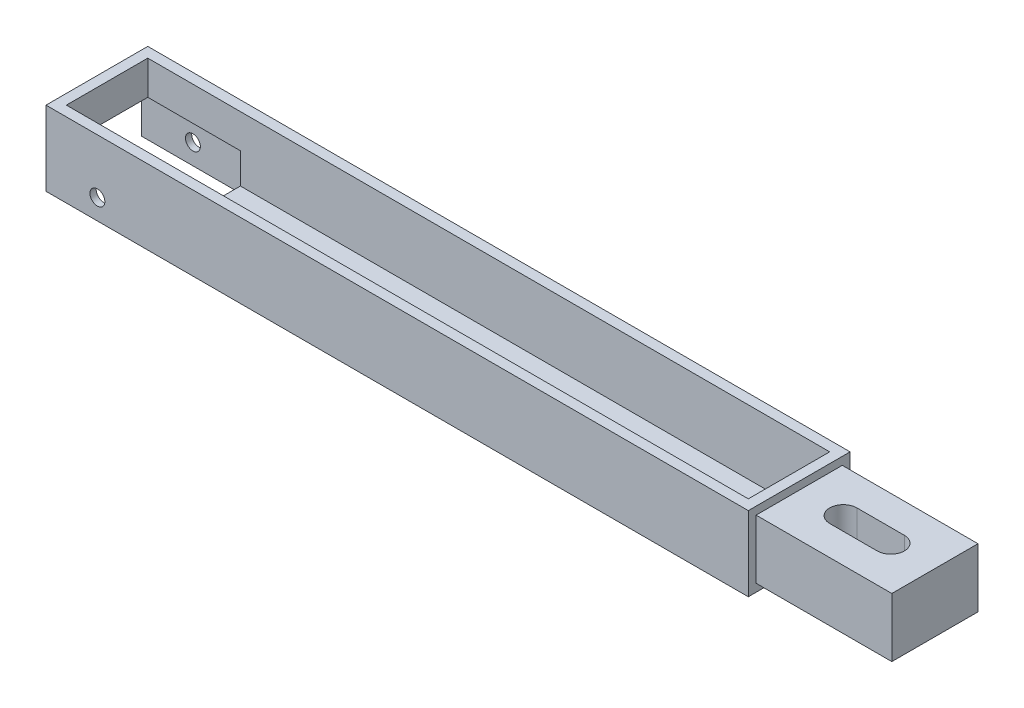
ISO-10303-21;
HEADER;
FILE_DESCRIPTION(('STEP AP214'),'2;1');
FILE_NAME('part.step','',(''),(''),'','','');
FILE_SCHEMA(('AUTOMOTIVE_DESIGN { 1 0 10303 214 1 1 1 1 }'));
ENDSEC;
DATA;
#1=APPLICATION_CONTEXT('core data for automotive mechanical design processes');
#2=APPLICATION_PROTOCOL_DEFINITION('international standard','automotive_design',2000,#1);
#3=PRODUCT_CONTEXT('',#1,'mechanical');
#4=PRODUCT('Part','Part','',(#3));
#5=PRODUCT_RELATED_PRODUCT_CATEGORY('part','',(#4));
#6=PRODUCT_DEFINITION_FORMATION('','',#4);
#7=PRODUCT_DEFINITION_CONTEXT('part definition',#1,'design');
#8=PRODUCT_DEFINITION('design','',#6,#7);
#9=PRODUCT_DEFINITION_SHAPE('','',#8);
#10=(LENGTH_UNIT() NAMED_UNIT(*) SI_UNIT(.MILLI.,.METRE.));
#11=(NAMED_UNIT(*) PLANE_ANGLE_UNIT() SI_UNIT($,.RADIAN.));
#12=(NAMED_UNIT(*) SI_UNIT($,.STERADIAN.) SOLID_ANGLE_UNIT());
#13=UNCERTAINTY_MEASURE_WITH_UNIT(LENGTH_MEASURE(1.E-05),#10,'distance_accuracy_value','');
#14=(GEOMETRIC_REPRESENTATION_CONTEXT(3) GLOBAL_UNCERTAINTY_ASSIGNED_CONTEXT((#13)) GLOBAL_UNIT_ASSIGNED_CONTEXT((#10,
#11,#12)) REPRESENTATION_CONTEXT('',''));
#15=CARTESIAN_POINT('',(0.,0.,0.));
#16=DIRECTION('',(0.,0.,1.));
#17=DIRECTION('',(1.,0.,0.));
#18=AXIS2_PLACEMENT_3D('',#15,#16,#17);
#19=CARTESIAN_POINT('',(103.5,22.,15.));
#20=DIRECTION('',(-1.,0.,0.));
#21=DIRECTION('',(0.,0.,1.));
#22=AXIS2_PLACEMENT_3D('',#19,#20,#21);
#23=PLANE('',#22);
#24=DIRECTION('',(0.,0.,-1.));
#25=VECTOR('',#24,1.);
#26=CARTESIAN_POINT('',(103.5,2.3,-12.7));
#27=LINE('',#26,#25);
#28=CARTESIAN_POINT('',(103.5,2.3,12.7));
#29=VERTEX_POINT('',#28);
#30=CARTESIAN_POINT('',(103.5,2.3,4.99999999999999));
#31=VERTEX_POINT('',#30);
#32=EDGE_CURVE('E49',#29,#31,#27,.T.);
#33=ORIENTED_EDGE('',*,*,#32,.F.);
#34=DIRECTION('',(0.,-1.,0.));
#35=VECTOR('',#34,1.);
#36=CARTESIAN_POINT('',(103.5,19.7,12.7));
#37=LINE('',#36,#35);
#38=CARTESIAN_POINT('',(103.5,19.7,12.7));
#39=VERTEX_POINT('',#38);
#40=EDGE_CURVE('E264',#39,#29,#37,.T.);
#41=ORIENTED_EDGE('',*,*,#40,.F.);
#42=DIRECTION('',(0.,0.,1.));
#43=VECTOR('',#42,1.);
#44=CARTESIAN_POINT('',(103.5,19.7,-12.7));
#45=LINE('',#44,#43);
#46=CARTESIAN_POINT('',(103.5,19.7,-12.7));
#47=VERTEX_POINT('',#46);
#48=EDGE_CURVE('E269',#47,#39,#45,.T.);
#49=ORIENTED_EDGE('',*,*,#48,.F.);
#50=DIRECTION('',(0.,1.,0.));
#51=VECTOR('',#50,1.);
#52=CARTESIAN_POINT('',(103.5,19.7,-12.7));
#53=LINE('',#52,#51);
#54=CARTESIAN_POINT('',(103.5,2.3,-12.7));
#55=VERTEX_POINT('',#54);
#56=EDGE_CURVE('E279',#55,#47,#53,.T.);
#57=ORIENTED_EDGE('',*,*,#56,.F.);
#58=CARTESIAN_POINT('',(103.5,2.3,-5.00000000000001));
#59=VERTEX_POINT('',#58);
#60=EDGE_CURVE('E11',#59,#55,#27,.T.);
#61=ORIENTED_EDGE('',*,*,#60,.F.);
#62=DIRECTION('',(0.,-1.,0.));
#63=VECTOR('',#62,1.);
#64=CARTESIAN_POINT('',(103.5,3.,-5.00000000000001));
#65=LINE('',#64,#63);
#66=CARTESIAN_POINT('',(103.5,0.,-5.00000000000001));
#67=VERTEX_POINT('',#66);
#68=EDGE_CURVE('E364',#59,#67,#65,.T.);
#69=ORIENTED_EDGE('',*,*,#68,.T.);
#70=DIRECTION('',(0.,0.,-1.));
#71=VECTOR('',#70,1.);
#72=CARTESIAN_POINT('',(103.5,0.,15.));
#73=LINE('',#72,#71);
#74=CARTESIAN_POINT('',(103.5,0.,-15.));
#75=VERTEX_POINT('',#74);
#76=EDGE_CURVE('E386',#67,#75,#73,.T.);
#77=ORIENTED_EDGE('',*,*,#76,.T.);
#78=DIRECTION('',(0.,-1.,0.));
#79=VECTOR('',#78,1.);
#80=CARTESIAN_POINT('',(103.5,22.,-15.));
#81=LINE('',#80,#79);
#82=CARTESIAN_POINT('',(103.5,22.,-15.));
#83=VERTEX_POINT('',#82);
#84=EDGE_CURVE('E438',#83,#75,#81,.T.);
#85=ORIENTED_EDGE('',*,*,#84,.F.);
#86=DIRECTION('',(0.,0.,-1.));
#87=VECTOR('',#86,1.);
#88=CARTESIAN_POINT('',(103.5,22.,15.));
#89=LINE('',#88,#87);
#90=CARTESIAN_POINT('',(103.5,22.,15.));
#91=VERTEX_POINT('',#90);
#92=EDGE_CURVE('E409',#91,#83,#89,.T.);
#93=ORIENTED_EDGE('',*,*,#92,.F.);
#94=DIRECTION('',(0.,-1.,0.));
#95=VECTOR('',#94,1.);
#96=CARTESIAN_POINT('',(103.5,22.,15.));
#97=LINE('',#96,#95);
#98=CARTESIAN_POINT('',(103.5,0.,15.));
#99=VERTEX_POINT('',#98);
#100=EDGE_CURVE('E419',#91,#99,#97,.T.);
#101=ORIENTED_EDGE('',*,*,#100,.T.);
#102=CARTESIAN_POINT('',(103.5,0.,4.99999999999999));
#103=VERTEX_POINT('',#102);
#104=EDGE_CURVE('E420',#99,#103,#73,.T.);
#105=ORIENTED_EDGE('',*,*,#104,.T.);
#106=DIRECTION('',(0.,-1.,0.));
#107=VECTOR('',#106,1.);
#108=CARTESIAN_POINT('',(103.5,3.,4.99999999999999));
#109=LINE('',#108,#107);
#110=EDGE_CURVE('E374',#31,#103,#109,.T.);
#111=ORIENTED_EDGE('',*,*,#110,.F.);
#112=EDGE_LOOP('',(#33,#41,#49,#57,#61,#69,#77,#85,#93,#101,#105,#111));
#113=FACE_BOUND('',#112,.T.);
#114=ADVANCED_FACE('F39',(#113),#23,.F.);
#115=CARTESIAN_POINT('',(-100.5,22.,15.));
#116=DIRECTION('',(1.,0.,0.));
#117=DIRECTION('',(0.,0.,-1.));
#118=AXIS2_PLACEMENT_3D('',#115,#116,#117);
#119=PLANE('',#118);
#120=DIRECTION('',(0.,-1.,0.));
#121=VECTOR('',#120,1.);
#122=CARTESIAN_POINT('',(-100.5,22.,12.));
#123=LINE('',#122,#121);
#124=CARTESIAN_POINT('',(-100.5,22.,12.));
#125=VERTEX_POINT('',#124);
#126=CARTESIAN_POINT('',(-100.5,12.,12.));
#127=VERTEX_POINT('',#126);
#128=EDGE_CURVE('E391',#125,#127,#123,.T.);
#129=ORIENTED_EDGE('',*,*,#128,.T.);
#130=DIRECTION('',(0.,0.,-1.));
#131=VECTOR('',#130,1.);
#132=CARTESIAN_POINT('',(-100.5,12.,15.));
#133=LINE('',#132,#131);
#134=CARTESIAN_POINT('',(-100.5,12.,-12.));
#135=VERTEX_POINT('',#134);
#136=EDGE_CURVE('E348',#127,#135,#133,.T.);
#137=ORIENTED_EDGE('',*,*,#136,.T.);
#138=DIRECTION('',(0.,-1.,0.));
#139=VECTOR('',#138,1.);
#140=CARTESIAN_POINT('',(-100.5,22.,-12.));
#141=LINE('',#140,#139);
#142=CARTESIAN_POINT('',(-100.5,22.,-12.));
#143=VERTEX_POINT('',#142);
#144=EDGE_CURVE('E387',#143,#135,#141,.T.);
#145=ORIENTED_EDGE('',*,*,#144,.F.);
#146=DIRECTION('',(0.,0.,1.));
#147=VECTOR('',#146,1.);
#148=CARTESIAN_POINT('',(-100.5,22.,0.));
#149=LINE('',#148,#147);
#150=EDGE_CURVE('E405',#143,#125,#149,.T.);
#151=ORIENTED_EDGE('',*,*,#150,.T.);
#152=EDGE_LOOP('',(#129,#137,#145,#151));
#153=FACE_BOUND('',#152,.T.);
#154=ADVANCED_FACE('F451',(#153),#119,.T.);
#155=CARTESIAN_POINT('',(0.,3.,0.));
#156=DIRECTION('',(0.,-1.,0.));
#157=DIRECTION('',(0.,0.,-1.));
#158=AXIS2_PLACEMENT_3D('',#155,#156,#157);
#159=PLANE('',#158);
#160=DIRECTION('',(-1.,0.,0.));
#161=VECTOR('',#160,1.);
#162=CARTESIAN_POINT('',(103.5,3.,4.99999999999999));
#163=LINE('',#162,#161);
#164=CARTESIAN_POINT('',(100.5,3.,4.99999999999999));
#165=VERTEX_POINT('',#164);
#166=CARTESIAN_POINT('',(-73.1999999999998,3.,4.99999999999999));
#167=VERTEX_POINT('',#166);
#168=EDGE_CURVE('E360',#165,#167,#163,.T.);
#169=ORIENTED_EDGE('',*,*,#168,.T.);
#170=DIRECTION('',(0.,0.,1.));
#171=VECTOR('',#170,1.);
#172=CARTESIAN_POINT('',(-73.1999999999998,3.,0.));
#173=LINE('',#172,#171);
#174=CARTESIAN_POINT('',(-73.1999999999998,3.,12.));
#175=VERTEX_POINT('',#174);
#176=EDGE_CURVE('E343',#167,#175,#173,.T.);
#177=ORIENTED_EDGE('',*,*,#176,.T.);
#178=DIRECTION('',(1.,0.,0.));
#179=VECTOR('',#178,1.);
#180=CARTESIAN_POINT('',(0.,3.,12.));
#181=LINE('',#180,#179);
#182=CARTESIAN_POINT('',(100.5,3.,12.));
#183=VERTEX_POINT('',#182);
#184=EDGE_CURVE('E395',#175,#183,#181,.T.);
#185=ORIENTED_EDGE('',*,*,#184,.T.);
#186=DIRECTION('',(0.,0.,-1.));
#187=VECTOR('',#186,1.);
#188=CARTESIAN_POINT('',(100.5,3.,0.));
#189=LINE('',#188,#187);
#190=EDGE_CURVE('E378',#183,#165,#189,.T.);
#191=ORIENTED_EDGE('',*,*,#190,.T.);
#192=EDGE_LOOP('',(#169,#177,#185,#191));
#193=FACE_BOUND('',#192,.T.);
#194=ADVANCED_FACE('F469',(#193),#159,.F.);
#195=CARTESIAN_POINT('',(0.,0.,0.));
#196=DIRECTION('',(0.,-1.,0.));
#197=DIRECTION('',(0.,0.,-1.));
#198=AXIS2_PLACEMENT_3D('',#195,#196,#197);
#199=PLANE('',#198);
#200=DIRECTION('',(-1.,0.,0.));
#201=VECTOR('',#200,1.);
#202=CARTESIAN_POINT('',(-73.1999999999998,0.,13.15));
#203=LINE('',#202,#201);
#204=CARTESIAN_POINT('',(-73.1999999999998,0.,13.15));
#205=VERTEX_POINT('',#204);
#206=CARTESIAN_POINT('',(-103.5,0.,13.15));
#207=VERTEX_POINT('',#206);
#208=EDGE_CURVE('E309',#205,#207,#203,.T.);
#209=ORIENTED_EDGE('',*,*,#208,.F.);
#210=DIRECTION('',(0.,0.,1.));
#211=VECTOR('',#210,1.);
#212=CARTESIAN_POINT('',(-73.1999999999998,0.,-13.15));
#213=LINE('',#212,#211);
#214=CARTESIAN_POINT('',(-73.1999999999998,0.,4.99999999999999));
#215=VERTEX_POINT('',#214);
#216=EDGE_CURVE('E322',#215,#205,#213,.T.);
#217=ORIENTED_EDGE('',*,*,#216,.F.);
#218=DIRECTION('',(-1.,0.,0.));
#219=VECTOR('',#218,1.);
#220=CARTESIAN_POINT('',(103.5,0.,4.99999999999999));
#221=LINE('',#220,#219);
#222=EDGE_CURVE('E367',#103,#215,#221,.T.);
#223=ORIENTED_EDGE('',*,*,#222,.F.);
#224=ORIENTED_EDGE('',*,*,#104,.F.);
#225=DIRECTION('',(1.,0.,0.));
#226=VECTOR('',#225,1.);
#227=CARTESIAN_POINT('',(-103.5,0.,15.));
#228=LINE('',#227,#226);
#229=CARTESIAN_POINT('',(-103.5,0.,15.));
#230=VERTEX_POINT('',#229);
#231=EDGE_CURVE('E413',#230,#99,#228,.T.);
#232=ORIENTED_EDGE('',*,*,#231,.F.);
#233=DIRECTION('',(0.,0.,1.));
#234=VECTOR('',#233,1.);
#235=CARTESIAN_POINT('',(-103.5,0.,15.));
#236=LINE('',#235,#234);
#237=EDGE_CURVE('E425',#207,#230,#236,.T.);
#238=ORIENTED_EDGE('',*,*,#237,.F.);
#239=EDGE_LOOP('',(#209,#217,#223,#224,#232,#238));
#240=FACE_BOUND('',#239,.T.);
#241=ADVANCED_FACE('F480',(#240),#199,.T.);
#242=CARTESIAN_POINT('',(0.,22.,0.));
#243=DIRECTION('',(0.,-1.,0.));
#244=DIRECTION('',(0.,0.,-1.));
#245=AXIS2_PLACEMENT_3D('',#242,#243,#244);
#246=PLANE('',#245);
#247=ORIENTED_EDGE('',*,*,#92,.T.);
#248=DIRECTION('',(-1.,0.,0.));
#249=VECTOR('',#248,1.);
#250=CARTESIAN_POINT('',(-103.5,22.,-15.));
#251=LINE('',#250,#249);
#252=CARTESIAN_POINT('',(-103.5,22.,-15.));
#253=VERTEX_POINT('',#252);
#254=EDGE_CURVE('E412',#83,#253,#251,.T.);
#255=ORIENTED_EDGE('',*,*,#254,.T.);
#256=DIRECTION('',(0.,0.,1.));
#257=VECTOR('',#256,1.);
#258=CARTESIAN_POINT('',(-103.5,22.,15.));
#259=LINE('',#258,#257);
#260=CARTESIAN_POINT('',(-103.5,22.,15.));
#261=VERTEX_POINT('',#260);
#262=EDGE_CURVE('E415',#253,#261,#259,.T.);
#263=ORIENTED_EDGE('',*,*,#262,.T.);
#264=DIRECTION('',(1.,0.,0.));
#265=VECTOR('',#264,1.);
#266=CARTESIAN_POINT('',(-103.5,22.,15.));
#267=LINE('',#266,#265);
#268=EDGE_CURVE('E417',#261,#91,#267,.T.);
#269=ORIENTED_EDGE('',*,*,#268,.T.);
#270=EDGE_LOOP('',(#247,#255,#263,#269));
#271=FACE_BOUND('',#270,.T.);
#272=DIRECTION('',(0.,0.,-1.));
#273=VECTOR('',#272,1.);
#274=CARTESIAN_POINT('',(100.5,22.,0.));
#275=LINE('',#274,#273);
#276=CARTESIAN_POINT('',(100.5,22.,12.));
#277=VERTEX_POINT('',#276);
#278=CARTESIAN_POINT('',(100.5,22.,-12.));
#279=VERTEX_POINT('',#278);
#280=EDGE_CURVE('E401',#277,#279,#275,.T.);
#281=ORIENTED_EDGE('',*,*,#280,.F.);
#282=DIRECTION('',(1.,0.,0.));
#283=VECTOR('',#282,1.);
#284=CARTESIAN_POINT('',(0.,22.,12.));
#285=LINE('',#284,#283);
#286=EDGE_CURVE('E392',#125,#277,#285,.T.);
#287=ORIENTED_EDGE('',*,*,#286,.F.);
#288=ORIENTED_EDGE('',*,*,#150,.F.);
#289=DIRECTION('',(-1.,0.,0.));
#290=VECTOR('',#289,1.);
#291=CARTESIAN_POINT('',(0.,22.,-12.));
#292=LINE('',#291,#290);
#293=EDGE_CURVE('E403',#279,#143,#292,.T.);
#294=ORIENTED_EDGE('',*,*,#293,.F.);
#295=EDGE_LOOP('',(#281,#287,#288,#294));
#296=FACE_BOUND('',#295,.T.);
#297=ADVANCED_FACE('F458',(#271,#296),#246,.F.);
#298=CARTESIAN_POINT('',(-103.5,22.,-15.));
#299=DIRECTION('',(0.,0.,1.));
#300=DIRECTION('',(1.,0.,0.));
#301=AXIS2_PLACEMENT_3D('',#298,#299,#300);
#302=PLANE('',#301);
#303=CARTESIAN_POINT('',(-88.3499999999999,6.,-15.));
#304=DIRECTION('',(0.,0.,1.));
#305=DIRECTION('',(1.,0.,0.));
#306=AXIS2_PLACEMENT_3D('',#303,#304,#305);
#307=CIRCLE('',#306,2.2);
#308=CARTESIAN_POINT('',(-86.1499999999998,6.,-15.));
#309=VERTEX_POINT('',#308);
#310=EDGE_CURVE('E296',#309,#309,#307,.T.);
#311=ORIENTED_EDGE('',*,*,#310,.T.);
#312=EDGE_LOOP('',(#311));
#313=FACE_BOUND('',#312,.T.);
#314=DIRECTION('',(-1.,0.,0.));
#315=VECTOR('',#314,1.);
#316=CARTESIAN_POINT('',(-103.5,0.,-15.));
#317=LINE('',#316,#315);
#318=CARTESIAN_POINT('',(-103.5,0.,-15.));
#319=VERTEX_POINT('',#318);
#320=EDGE_CURVE('E423',#75,#319,#317,.T.);
#321=ORIENTED_EDGE('',*,*,#320,.T.);
#322=DIRECTION('',(0.,-1.,0.));
#323=VECTOR('',#322,1.);
#324=CARTESIAN_POINT('',(-103.5,22.,-15.));
#325=LINE('',#324,#323);
#326=EDGE_CURVE('E435',#253,#319,#325,.T.);
#327=ORIENTED_EDGE('',*,*,#326,.F.);
#328=ORIENTED_EDGE('',*,*,#254,.F.);
#329=ORIENTED_EDGE('',*,*,#84,.T.);
#330=EDGE_LOOP('',(#321,#327,#328,#329));
#331=FACE_BOUND('',#330,.T.);
#332=ADVANCED_FACE('F551',(#313,#331),#302,.F.);
#333=CARTESIAN_POINT('',(-103.5,22.,15.));
#334=DIRECTION('',(1.,0.,0.));
#335=DIRECTION('',(0.,0.,-1.));
#336=AXIS2_PLACEMENT_3D('',#333,#334,#335);
#337=PLANE('',#336);
#338=DIRECTION('',(0.,0.,-1.));
#339=VECTOR('',#338,1.);
#340=CARTESIAN_POINT('',(-103.5,12.,-13.15));
#341=LINE('',#340,#339);
#342=CARTESIAN_POINT('',(-103.5,12.,13.15));
#343=VERTEX_POINT('',#342);
#344=CARTESIAN_POINT('',(-103.5,12.,-13.15));
#345=VERTEX_POINT('',#344);
#346=EDGE_CURVE('E305',#343,#345,#341,.T.);
#347=ORIENTED_EDGE('',*,*,#346,.F.);
#348=DIRECTION('',(0.,-1.,0.));
#349=VECTOR('',#348,1.);
#350=CARTESIAN_POINT('',(-103.5,12.,13.15));
#351=LINE('',#350,#349);
#352=EDGE_CURVE('E326',#343,#207,#351,.T.);
#353=ORIENTED_EDGE('',*,*,#352,.T.);
#354=ORIENTED_EDGE('',*,*,#237,.T.);
#355=DIRECTION('',(0.,-1.,0.));
#356=VECTOR('',#355,1.);
#357=CARTESIAN_POINT('',(-103.5,22.,15.));
#358=LINE('',#357,#356);
#359=EDGE_CURVE('E432',#261,#230,#358,.T.);
#360=ORIENTED_EDGE('',*,*,#359,.F.);
#361=ORIENTED_EDGE('',*,*,#262,.F.);
#362=ORIENTED_EDGE('',*,*,#326,.T.);
#363=CARTESIAN_POINT('',(-103.5,0.,-13.15));
#364=VERTEX_POINT('',#363);
#365=EDGE_CURVE('E426',#319,#364,#236,.T.);
#366=ORIENTED_EDGE('',*,*,#365,.T.);
#367=DIRECTION('',(0.,-1.,0.));
#368=VECTOR('',#367,1.);
#369=CARTESIAN_POINT('',(-103.5,12.,-13.15));
#370=LINE('',#369,#368);
#371=EDGE_CURVE('E319',#345,#364,#370,.T.);
#372=ORIENTED_EDGE('',*,*,#371,.F.);
#373=EDGE_LOOP('',(#347,#353,#354,#360,#361,#362,#366,#372));
#374=FACE_BOUND('',#373,.T.);
#375=ADVANCED_FACE('F493',(#374),#337,.F.);
#376=CARTESIAN_POINT('',(-103.5,22.,15.));
#377=DIRECTION('',(0.,0.,-1.));
#378=DIRECTION('',(-1.,0.,0.));
#379=AXIS2_PLACEMENT_3D('',#376,#377,#378);
#380=PLANE('',#379);
#381=CARTESIAN_POINT('',(-88.3499999999999,6.,15.));
#382=DIRECTION('',(0.,0.,1.));
#383=DIRECTION('',(1.,0.,0.));
#384=AXIS2_PLACEMENT_3D('',#381,#382,#383);
#385=CIRCLE('',#384,2.2);
#386=CARTESIAN_POINT('',(-86.1499999999998,6.,15.));
#387=VERTEX_POINT('',#386);
#388=EDGE_CURVE('E295',#387,#387,#385,.T.);
#389=ORIENTED_EDGE('',*,*,#388,.F.);
#390=EDGE_LOOP('',(#389));
#391=FACE_BOUND('',#390,.T.);
#392=ORIENTED_EDGE('',*,*,#231,.T.);
#393=ORIENTED_EDGE('',*,*,#100,.F.);
#394=ORIENTED_EDGE('',*,*,#268,.F.);
#395=ORIENTED_EDGE('',*,*,#359,.T.);
#396=EDGE_LOOP('',(#392,#393,#394,#395));
#397=FACE_BOUND('',#396,.T.);
#398=ADVANCED_FACE('F488',(#391,#397),#380,.F.);
#399=CARTESIAN_POINT('',(-73.1999999999998,0.,-13.15));
#400=VERTEX_POINT('',#399);
#401=CARTESIAN_POINT('',(-73.1999999999998,0.,-5.00000000000001));
#402=VERTEX_POINT('',#401);
#403=EDGE_CURVE('E323',#400,#402,#213,.T.);
#404=ORIENTED_EDGE('',*,*,#403,.F.);
#405=DIRECTION('',(1.,0.,0.));
#406=VECTOR('',#405,1.);
#407=CARTESIAN_POINT('',(-73.1999999999998,0.,-13.15));
#408=LINE('',#407,#406);
#409=EDGE_CURVE('E304',#364,#400,#408,.T.);
#410=ORIENTED_EDGE('',*,*,#409,.F.);
#411=ORIENTED_EDGE('',*,*,#365,.F.);
#412=ORIENTED_EDGE('',*,*,#320,.F.);
#413=ORIENTED_EDGE('',*,*,#76,.F.);
#414=DIRECTION('',(1.,0.,0.));
#415=VECTOR('',#414,1.);
#416=CARTESIAN_POINT('',(103.5,0.,-5.00000000000001));
#417=LINE('',#416,#415);
#418=EDGE_CURVE('E354',#402,#67,#417,.T.);
#419=ORIENTED_EDGE('',*,*,#418,.F.);
#420=EDGE_LOOP('',(#404,#410,#411,#412,#413,#419));
#421=FACE_BOUND('',#420,.T.);
#422=ADVANCED_FACE('F507',(#421),#199,.T.);
#423=CARTESIAN_POINT('',(100.5,22.,15.));
#424=DIRECTION('',(-1.,0.,0.));
#425=DIRECTION('',(0.,0.,1.));
#426=AXIS2_PLACEMENT_3D('',#423,#424,#425);
#427=PLANE('',#426);
#428=ORIENTED_EDGE('',*,*,#190,.F.);
#429=DIRECTION('',(0.,-1.,0.));
#430=VECTOR('',#429,1.);
#431=CARTESIAN_POINT('',(100.5,22.,12.));
#432=LINE('',#431,#430);
#433=EDGE_CURVE('E388',#277,#183,#432,.T.);
#434=ORIENTED_EDGE('',*,*,#433,.F.);
#435=ORIENTED_EDGE('',*,*,#280,.T.);
#436=DIRECTION('',(0.,-1.,0.));
#437=VECTOR('',#436,1.);
#438=CARTESIAN_POINT('',(100.5,22.,-12.));
#439=LINE('',#438,#437);
#440=CARTESIAN_POINT('',(100.5,3.,-12.));
#441=VERTEX_POINT('',#440);
#442=EDGE_CURVE('E383',#279,#441,#439,.T.);
#443=ORIENTED_EDGE('',*,*,#442,.T.);
#444=CARTESIAN_POINT('',(100.5,3.,-5.00000000000001));
#445=VERTEX_POINT('',#444);
#446=EDGE_CURVE('E382',#445,#441,#189,.T.);
#447=ORIENTED_EDGE('',*,*,#446,.F.);
#448=EDGE_CURVE('E373',#165,#445,#189,.T.);
#449=ORIENTED_EDGE('',*,*,#448,.F.);
#450=EDGE_LOOP('',(#428,#434,#435,#443,#447,#449));
#451=FACE_BOUND('',#450,.T.);
#452=ADVANCED_FACE('F462',(#451),#427,.T.);
#453=CARTESIAN_POINT('',(-103.5,22.,-12.));
#454=DIRECTION('',(0.,0.,1.));
#455=DIRECTION('',(1.,0.,0.));
#456=AXIS2_PLACEMENT_3D('',#453,#454,#455);
#457=PLANE('',#456);
#458=DIRECTION('',(0.,1.,0.));
#459=VECTOR('',#458,1.);
#460=CARTESIAN_POINT('',(-73.1999999999998,22.,-12.));
#461=LINE('',#460,#459);
#462=CARTESIAN_POINT('',(-73.1999999999998,3.,-12.));
#463=VERTEX_POINT('',#462);
#464=CARTESIAN_POINT('',(-73.1999999999998,12.,-12.));
#465=VERTEX_POINT('',#464);
#466=EDGE_CURVE('E338',#463,#465,#461,.T.);
#467=ORIENTED_EDGE('',*,*,#466,.F.);
#468=DIRECTION('',(-1.,0.,0.));
#469=VECTOR('',#468,1.);
#470=CARTESIAN_POINT('',(0.,3.,-12.));
#471=LINE('',#470,#469);
#472=EDGE_CURVE('E381',#441,#463,#471,.T.);
#473=ORIENTED_EDGE('',*,*,#472,.F.);
#474=ORIENTED_EDGE('',*,*,#442,.F.);
#475=ORIENTED_EDGE('',*,*,#293,.T.);
#476=ORIENTED_EDGE('',*,*,#144,.T.);
#477=DIRECTION('',(1.,0.,0.));
#478=VECTOR('',#477,1.);
#479=CARTESIAN_POINT('',(-103.5,12.,-12.));
#480=LINE('',#479,#478);
#481=EDGE_CURVE('E351',#135,#465,#480,.T.);
#482=ORIENTED_EDGE('',*,*,#481,.T.);
#483=EDGE_LOOP('',(#467,#473,#474,#475,#476,#482));
#484=FACE_BOUND('',#483,.T.);
#485=ADVANCED_FACE('F525',(#484),#457,.T.);
#486=CARTESIAN_POINT('',(-103.5,22.,12.));
#487=DIRECTION('',(0.,0.,-1.));
#488=DIRECTION('',(-1.,0.,0.));
#489=AXIS2_PLACEMENT_3D('',#486,#487,#488);
#490=PLANE('',#489);
#491=DIRECTION('',(0.,-1.,0.));
#492=VECTOR('',#491,1.);
#493=CARTESIAN_POINT('',(-73.1999999999998,22.,12.));
#494=LINE('',#493,#492);
#495=CARTESIAN_POINT('',(-73.1999999999998,12.,12.));
#496=VERTEX_POINT('',#495);
#497=EDGE_CURVE('E346',#496,#175,#494,.T.);
#498=ORIENTED_EDGE('',*,*,#497,.F.);
#499=DIRECTION('',(-1.,0.,0.));
#500=VECTOR('',#499,1.);
#501=CARTESIAN_POINT('',(-103.5,12.,12.));
#502=LINE('',#501,#500);
#503=EDGE_CURVE('E47',#496,#127,#502,.T.);
#504=ORIENTED_EDGE('',*,*,#503,.T.);
#505=ORIENTED_EDGE('',*,*,#128,.F.);
#506=ORIENTED_EDGE('',*,*,#286,.T.);
#507=ORIENTED_EDGE('',*,*,#433,.T.);
#508=ORIENTED_EDGE('',*,*,#184,.F.);
#509=EDGE_LOOP('',(#498,#504,#505,#506,#507,#508));
#510=FACE_BOUND('',#509,.T.);
#511=ADVANCED_FACE('F446',(#510),#490,.T.);
#512=ORIENTED_EDGE('',*,*,#472,.T.);
#513=DIRECTION('',(0.,0.,1.));
#514=VECTOR('',#513,1.);
#515=CARTESIAN_POINT('',(-73.1999999999998,3.,0.));
#516=LINE('',#515,#514);
#517=CARTESIAN_POINT('',(-73.1999999999998,3.,-5.00000000000001));
#518=VERTEX_POINT('',#517);
#519=EDGE_CURVE('E329',#463,#518,#516,.T.);
#520=ORIENTED_EDGE('',*,*,#519,.T.);
#521=DIRECTION('',(1.,0.,0.));
#522=VECTOR('',#521,1.);
#523=CARTESIAN_POINT('',(103.5,3.,-5.00000000000001));
#524=LINE('',#523,#522);
#525=EDGE_CURVE('E355',#518,#445,#524,.T.);
#526=ORIENTED_EDGE('',*,*,#525,.T.);
#527=ORIENTED_EDGE('',*,*,#446,.T.);
#528=EDGE_LOOP('',(#512,#520,#526,#527));
#529=FACE_BOUND('',#528,.T.);
#530=ADVANCED_FACE('F521',(#529),#159,.F.);
#531=CARTESIAN_POINT('',(0.,3.,0.));
#532=DIRECTION('',(0.,-1.,0.));
#533=DIRECTION('',(0.,0.,-1.));
#534=AXIS2_PLACEMENT_3D('',#531,#532,#533);
#535=PLANE('',#534);
#536=ORIENTED_EDGE('',*,*,#448,.T.);
#537=CARTESIAN_POINT('',(103.5,3.,-5.00000000000001));
#538=VERTEX_POINT('',#537);
#539=EDGE_CURVE('E358',#445,#538,#524,.T.);
#540=ORIENTED_EDGE('',*,*,#539,.T.);
#541=DIRECTION('',(0.,0.,1.));
#542=VECTOR('',#541,1.);
#543=CARTESIAN_POINT('',(103.5,3.,-5.00000000000001));
#544=LINE('',#543,#542);
#545=CARTESIAN_POINT('',(103.5,3.,4.99999999999999));
#546=VERTEX_POINT('',#545);
#547=EDGE_CURVE('E357',#538,#546,#544,.T.);
#548=ORIENTED_EDGE('',*,*,#547,.T.);
#549=EDGE_CURVE('E361',#546,#165,#163,.T.);
#550=ORIENTED_EDGE('',*,*,#549,.T.);
#551=EDGE_LOOP('',(#536,#540,#548,#550));
#552=FACE_BOUND('',#551,.T.);
#553=ADVANCED_FACE('F527',(#552),#535,.T.);
#554=CARTESIAN_POINT('',(103.5,3.,4.99999999999999));
#555=DIRECTION('',(0.,0.,1.));
#556=DIRECTION('',(1.,0.,0.));
#557=AXIS2_PLACEMENT_3D('',#554,#555,#556);
#558=PLANE('',#557);
#559=ORIENTED_EDGE('',*,*,#222,.T.);
#560=DIRECTION('',(0.,1.,0.));
#561=VECTOR('',#560,1.);
#562=CARTESIAN_POINT('',(-73.1999999999998,3.,4.99999999999999));
#563=LINE('',#562,#561);
#564=EDGE_CURVE('E340',#215,#167,#563,.T.);
#565=ORIENTED_EDGE('',*,*,#564,.T.);
#566=ORIENTED_EDGE('',*,*,#168,.F.);
#567=ORIENTED_EDGE('',*,*,#549,.F.);
#568=EDGE_CURVE('E370',#546,#31,#109,.T.);
#569=ORIENTED_EDGE('',*,*,#568,.T.);
#570=ORIENTED_EDGE('',*,*,#110,.T.);
#571=EDGE_LOOP('',(#559,#565,#566,#567,#569,#570));
#572=FACE_BOUND('',#571,.T.);
#573=ADVANCED_FACE('F474',(#572),#558,.F.);
#574=CARTESIAN_POINT('',(103.5,3.,-5.00000000000001));
#575=DIRECTION('',(0.,0.,-1.));
#576=DIRECTION('',(-1.,0.,0.));
#577=AXIS2_PLACEMENT_3D('',#574,#575,#576);
#578=PLANE('',#577);
#579=ORIENTED_EDGE('',*,*,#525,.F.);
#580=DIRECTION('',(0.,-1.,0.));
#581=VECTOR('',#580,1.);
#582=CARTESIAN_POINT('',(-73.1999999999998,3.,-5.00000000000001));
#583=LINE('',#582,#581);
#584=EDGE_CURVE('E441',#518,#402,#583,.T.);
#585=ORIENTED_EDGE('',*,*,#584,.T.);
#586=ORIENTED_EDGE('',*,*,#418,.T.);
#587=ORIENTED_EDGE('',*,*,#68,.F.);
#588=EDGE_CURVE('E375',#538,#59,#65,.T.);
#589=ORIENTED_EDGE('',*,*,#588,.F.);
#590=ORIENTED_EDGE('',*,*,#539,.F.);
#591=EDGE_LOOP('',(#579,#585,#586,#587,#589,#590));
#592=FACE_BOUND('',#591,.T.);
#593=ADVANCED_FACE('F516',(#592),#578,.F.);
#594=CARTESIAN_POINT('',(-73.1999999999998,12.,-13.15));
#595=DIRECTION('',(1.,0.,0.));
#596=DIRECTION('',(0.,0.,-1.));
#597=AXIS2_PLACEMENT_3D('',#594,#595,#596);
#598=PLANE('',#597);
#599=ORIENTED_EDGE('',*,*,#497,.T.);
#600=ORIENTED_EDGE('',*,*,#176,.F.);
#601=ORIENTED_EDGE('',*,*,#564,.F.);
#602=ORIENTED_EDGE('',*,*,#216,.T.);
#603=DIRECTION('',(0.,-1.,0.));
#604=VECTOR('',#603,1.);
#605=CARTESIAN_POINT('',(-73.1999999999998,12.,13.15));
#606=LINE('',#605,#604);
#607=CARTESIAN_POINT('',(-73.1999999999998,12.,13.15));
#608=VERTEX_POINT('',#607);
#609=EDGE_CURVE('E330',#608,#205,#606,.T.);
#610=ORIENTED_EDGE('',*,*,#609,.F.);
#611=DIRECTION('',(0.,0.,1.));
#612=VECTOR('',#611,1.);
#613=CARTESIAN_POINT('',(-73.1999999999998,12.,-13.15));
#614=LINE('',#613,#612);
#615=EDGE_CURVE('E312',#496,#608,#614,.T.);
#616=ORIENTED_EDGE('',*,*,#615,.F.);
#617=EDGE_LOOP('',(#599,#600,#601,#602,#610,#616));
#618=FACE_BOUND('',#617,.T.);
#619=ADVANCED_FACE('F471',(#618),#598,.F.);
#620=CARTESIAN_POINT('',(-73.1999999999998,12.,13.15));
#621=DIRECTION('',(0.,0.,1.));
#622=DIRECTION('',(1.,0.,0.));
#623=AXIS2_PLACEMENT_3D('',#620,#621,#622);
#624=PLANE('',#623);
#625=CARTESIAN_POINT('',(-88.3499999999999,6.,13.15));
#626=DIRECTION('',(0.,0.,1.));
#627=DIRECTION('',(1.,0.,0.));
#628=AXIS2_PLACEMENT_3D('',#625,#626,#627);
#629=CIRCLE('',#628,2.2);
#630=CARTESIAN_POINT('',(-86.1499999999998,6.,13.15));
#631=VERTEX_POINT('',#630);
#632=EDGE_CURVE('E301',#631,#631,#629,.T.);
#633=ORIENTED_EDGE('',*,*,#632,.T.);
#634=EDGE_LOOP('',(#633));
#635=FACE_BOUND('',#634,.T.);
#636=ORIENTED_EDGE('',*,*,#208,.T.);
#637=ORIENTED_EDGE('',*,*,#352,.F.);
#638=DIRECTION('',(-1.,0.,0.));
#639=VECTOR('',#638,1.);
#640=CARTESIAN_POINT('',(-73.1999999999998,12.,13.15));
#641=LINE('',#640,#639);
#642=EDGE_CURVE('E316',#608,#343,#641,.T.);
#643=ORIENTED_EDGE('',*,*,#642,.F.);
#644=ORIENTED_EDGE('',*,*,#609,.T.);
#645=EDGE_LOOP('',(#636,#637,#643,#644));
#646=FACE_BOUND('',#645,.T.);
#647=ADVANCED_FACE('F498',(#635,#646),#624,.F.);
#648=ORIENTED_EDGE('',*,*,#466,.T.);
#649=CARTESIAN_POINT('',(-73.1999999999998,12.,-13.15));
#650=VERTEX_POINT('',#649);
#651=EDGE_CURVE('E313',#650,#465,#614,.T.);
#652=ORIENTED_EDGE('',*,*,#651,.F.);
#653=DIRECTION('',(0.,-1.,0.));
#654=VECTOR('',#653,1.);
#655=CARTESIAN_POINT('',(-73.1999999999998,12.,-13.15));
#656=LINE('',#655,#654);
#657=EDGE_CURVE('E333',#650,#400,#656,.T.);
#658=ORIENTED_EDGE('',*,*,#657,.T.);
#659=ORIENTED_EDGE('',*,*,#403,.T.);
#660=ORIENTED_EDGE('',*,*,#584,.F.);
#661=ORIENTED_EDGE('',*,*,#519,.F.);
#662=EDGE_LOOP('',(#648,#652,#658,#659,#660,#661));
#663=FACE_BOUND('',#662,.T.);
#664=ADVANCED_FACE('F512',(#663),#598,.F.);
#665=CARTESIAN_POINT('',(-73.1999999999998,12.,-13.15));
#666=DIRECTION('',(0.,0.,-1.));
#667=DIRECTION('',(-1.,0.,0.));
#668=AXIS2_PLACEMENT_3D('',#665,#666,#667);
#669=PLANE('',#668);
#670=CARTESIAN_POINT('',(-88.3499999999999,6.,-13.15));
#671=DIRECTION('',(0.,0.,-1.));
#672=DIRECTION('',(-1.,0.,0.));
#673=AXIS2_PLACEMENT_3D('',#670,#671,#672);
#674=CIRCLE('',#673,2.2);
#675=CARTESIAN_POINT('',(-90.5499999999998,6.,-13.15));
#676=VERTEX_POINT('',#675);
#677=EDGE_CURVE('E42',#676,#676,#674,.T.);
#678=ORIENTED_EDGE('',*,*,#677,.T.);
#679=EDGE_LOOP('',(#678));
#680=FACE_BOUND('',#679,.T.);
#681=ORIENTED_EDGE('',*,*,#409,.T.);
#682=ORIENTED_EDGE('',*,*,#657,.F.);
#683=DIRECTION('',(1.,0.,0.));
#684=VECTOR('',#683,1.);
#685=CARTESIAN_POINT('',(-73.1999999999998,12.,-13.15));
#686=LINE('',#685,#684);
#687=EDGE_CURVE('E308',#345,#650,#686,.T.);
#688=ORIENTED_EDGE('',*,*,#687,.F.);
#689=ORIENTED_EDGE('',*,*,#371,.T.);
#690=EDGE_LOOP('',(#681,#682,#688,#689));
#691=FACE_BOUND('',#690,.T.);
#692=ADVANCED_FACE('F504',(#680,#691),#669,.F.);
#693=CARTESIAN_POINT('',(0.,12.,0.));
#694=DIRECTION('',(0.,-1.,0.));
#695=DIRECTION('',(0.,0.,-1.));
#696=AXIS2_PLACEMENT_3D('',#693,#694,#695);
#697=PLANE('',#696);
#698=ORIENTED_EDGE('',*,*,#136,.F.);
#699=ORIENTED_EDGE('',*,*,#503,.F.);
#700=ORIENTED_EDGE('',*,*,#615,.T.);
#701=ORIENTED_EDGE('',*,*,#642,.T.);
#702=ORIENTED_EDGE('',*,*,#346,.T.);
#703=ORIENTED_EDGE('',*,*,#687,.T.);
#704=ORIENTED_EDGE('',*,*,#651,.T.);
#705=ORIENTED_EDGE('',*,*,#481,.F.);
#706=EDGE_LOOP('',(#698,#699,#700,#701,#702,#703,#704,#705));
#707=FACE_BOUND('',#706,.T.);
#708=ADVANCED_FACE('F499',(#707),#697,.T.);
#709=CARTESIAN_POINT('',(-88.3499999999999,6.,-15.));
#710=DIRECTION('',(0.,0.,1.));
#711=DIRECTION('',(1.,0.,0.));
#712=AXIS2_PLACEMENT_3D('',#709,#710,#711);
#713=CYLINDRICAL_SURFACE('',#712,2.2);
#714=ORIENTED_EDGE('',*,*,#310,.F.);
#715=EDGE_LOOP('',(#714));
#716=FACE_BOUND('',#715,.T.);
#717=ORIENTED_EDGE('',*,*,#677,.F.);
#718=EDGE_LOOP('',(#717));
#719=FACE_BOUND('',#718,.T.);
#720=ADVANCED_FACE('F668',(#716,#719),#713,.F.);
#721=ORIENTED_EDGE('',*,*,#388,.T.);
#722=EDGE_LOOP('',(#721));
#723=FACE_BOUND('',#722,.T.);
#724=ORIENTED_EDGE('',*,*,#632,.F.);
#725=EDGE_LOOP('',(#724));
#726=FACE_BOUND('',#725,.T.);
#727=ADVANCED_FACE('F676',(#723,#726),#713,.F.);
#728=CARTESIAN_POINT('',(103.5,0.,0.));
#729=DIRECTION('',(-1.,0.,0.));
#730=DIRECTION('',(0.,0.,1.));
#731=AXIS2_PLACEMENT_3D('',#728,#729,#730);
#732=PLANE('',#731);
#733=ORIENTED_EDGE('',*,*,#568,.F.);
#734=ORIENTED_EDGE('',*,*,#547,.F.);
#735=ORIENTED_EDGE('',*,*,#588,.T.);
#736=EDGE_CURVE('E50',#31,#59,#27,.T.);
#737=ORIENTED_EDGE('',*,*,#736,.F.);
#738=EDGE_LOOP('',(#733,#734,#735,#737));
#739=FACE_BOUND('',#738,.T.);
#740=ADVANCED_FACE('F532',(#739),#732,.T.);
#741=CARTESIAN_POINT('',(143.5,19.7,12.7));
#742=DIRECTION('',(0.,0.,-1.));
#743=DIRECTION('',(0.,1.,0.));
#744=AXIS2_PLACEMENT_3D('',#741,#742,#743);
#745=PLANE('',#744);
#746=ORIENTED_EDGE('',*,*,#40,.T.);
#747=DIRECTION('',(-1.,0.,0.));
#748=VECTOR('',#747,1.);
#749=CARTESIAN_POINT('',(143.5,2.3,12.7));
#750=LINE('',#749,#748);
#751=CARTESIAN_POINT('',(143.5,2.3,12.7));
#752=VERTEX_POINT('',#751);
#753=EDGE_CURVE('E292',#752,#29,#750,.T.);
#754=ORIENTED_EDGE('',*,*,#753,.F.);
#755=DIRECTION('',(0.,-1.,0.));
#756=VECTOR('',#755,1.);
#757=CARTESIAN_POINT('',(143.5,19.7,12.7));
#758=LINE('',#757,#756);
#759=CARTESIAN_POINT('',(143.5,19.7,12.7));
#760=VERTEX_POINT('',#759);
#761=EDGE_CURVE('E265',#760,#752,#758,.T.);
#762=ORIENTED_EDGE('',*,*,#761,.F.);
#763=DIRECTION('',(-1.,0.,0.));
#764=VECTOR('',#763,1.);
#765=CARTESIAN_POINT('',(143.5,19.7,12.7));
#766=LINE('',#765,#764);
#767=EDGE_CURVE('E275',#760,#39,#766,.T.);
#768=ORIENTED_EDGE('',*,*,#767,.T.);
#769=EDGE_LOOP('',(#746,#754,#762,#768));
#770=FACE_BOUND('',#769,.T.);
#771=ADVANCED_FACE('F542',(#770),#745,.F.);
#772=CARTESIAN_POINT('',(143.5,2.3,-12.7));
#773=DIRECTION('',(0.,1.,0.));
#774=DIRECTION('',(0.,0.,1.));
#775=AXIS2_PLACEMENT_3D('',#772,#773,#774);
#776=PLANE('',#775);
#777=DIRECTION('',(-1.,0.,0.));
#778=VECTOR('',#777,1.);
#779=CARTESIAN_POINT('',(143.5,2.3,-4.00000000000001));
#780=LINE('',#779,#778);
#781=CARTESIAN_POINT('',(130.5,2.3,-4.));
#782=VERTEX_POINT('',#781);
#783=CARTESIAN_POINT('',(116.5,2.3,-4.));
#784=VERTEX_POINT('',#783);
#785=EDGE_CURVE('E258',#782,#784,#780,.T.);
#786=ORIENTED_EDGE('',*,*,#785,.T.);
#787=CARTESIAN_POINT('',(116.5,2.3,0.));
#788=DIRECTION('',(0.,1.,0.));
#789=DIRECTION('',(0.,0.,1.));
#790=AXIS2_PLACEMENT_3D('',#787,#788,#789);
#791=CIRCLE('',#790,4.);
#792=CARTESIAN_POINT('',(116.5,2.3,4.));
#793=VERTEX_POINT('',#792);
#794=EDGE_CURVE('E261',#784,#793,#791,.T.);
#795=ORIENTED_EDGE('',*,*,#794,.T.);
#796=DIRECTION('',(1.,0.,0.));
#797=VECTOR('',#796,1.);
#798=CARTESIAN_POINT('',(143.5,2.3,4.));
#799=LINE('',#798,#797);
#800=CARTESIAN_POINT('',(130.5,2.3,4.));
#801=VERTEX_POINT('',#800);
#802=EDGE_CURVE('E253',#793,#801,#799,.T.);
#803=ORIENTED_EDGE('',*,*,#802,.T.);
#804=CARTESIAN_POINT('',(130.5,2.3,0.));
#805=DIRECTION('',(0.,1.,0.));
#806=DIRECTION('',(0.,0.,1.));
#807=AXIS2_PLACEMENT_3D('',#804,#805,#806);
#808=CIRCLE('',#807,4.);
#809=EDGE_CURVE('E233',#801,#782,#808,.T.);
#810=ORIENTED_EDGE('',*,*,#809,.T.);
#811=EDGE_LOOP('',(#786,#795,#803,#810));
#812=FACE_BOUND('',#811,.T.);
#813=ORIENTED_EDGE('',*,*,#32,.T.);
#814=ORIENTED_EDGE('',*,*,#736,.T.);
#815=ORIENTED_EDGE('',*,*,#60,.T.);
#816=DIRECTION('',(-1.,0.,0.));
#817=VECTOR('',#816,1.);
#818=CARTESIAN_POINT('',(143.5,2.3,-12.7));
#819=LINE('',#818,#817);
#820=CARTESIAN_POINT('',(143.5,2.3,-12.7));
#821=VERTEX_POINT('',#820);
#822=EDGE_CURVE('E289',#821,#55,#819,.T.);
#823=ORIENTED_EDGE('',*,*,#822,.F.);
#824=DIRECTION('',(0.,0.,-1.));
#825=VECTOR('',#824,1.);
#826=CARTESIAN_POINT('',(143.5,2.3,-12.7));
#827=LINE('',#826,#825);
#828=EDGE_CURVE('E268',#752,#821,#827,.T.);
#829=ORIENTED_EDGE('',*,*,#828,.F.);
#830=ORIENTED_EDGE('',*,*,#753,.T.);
#831=EDGE_LOOP('',(#813,#814,#815,#823,#829,#830));
#832=FACE_BOUND('',#831,.T.);
#833=ADVANCED_FACE('F535',(#812,#832),#776,.F.);
#834=CARTESIAN_POINT('',(143.5,19.7,-12.7));
#835=DIRECTION('',(0.,0.,1.));
#836=DIRECTION('',(0.,-1.,0.));
#837=AXIS2_PLACEMENT_3D('',#834,#835,#836);
#838=PLANE('',#837);
#839=ORIENTED_EDGE('',*,*,#56,.T.);
#840=DIRECTION('',(-1.,0.,0.));
#841=VECTOR('',#840,1.);
#842=CARTESIAN_POINT('',(143.5,19.7,-12.7));
#843=LINE('',#842,#841);
#844=CARTESIAN_POINT('',(143.5,19.7,-12.7));
#845=VERTEX_POINT('',#844);
#846=EDGE_CURVE('E286',#845,#47,#843,.T.);
#847=ORIENTED_EDGE('',*,*,#846,.F.);
#848=DIRECTION('',(0.,1.,0.));
#849=VECTOR('',#848,1.);
#850=CARTESIAN_POINT('',(143.5,19.7,-12.7));
#851=LINE('',#850,#849);
#852=EDGE_CURVE('E271',#821,#845,#851,.T.);
#853=ORIENTED_EDGE('',*,*,#852,.F.);
#854=ORIENTED_EDGE('',*,*,#822,.T.);
#855=EDGE_LOOP('',(#839,#847,#853,#854));
#856=FACE_BOUND('',#855,.T.);
#857=ADVANCED_FACE('F548',(#856),#838,.F.);
#858=CARTESIAN_POINT('',(143.5,19.7,-12.7));
#859=DIRECTION('',(0.,-1.,0.));
#860=DIRECTION('',(0.,0.,-1.));
#861=AXIS2_PLACEMENT_3D('',#858,#859,#860);
#862=PLANE('',#861);
#863=DIRECTION('',(1.,0.,0.));
#864=VECTOR('',#863,1.);
#865=CARTESIAN_POINT('',(116.5,19.7,4.00000000000001));
#866=LINE('',#865,#864);
#867=CARTESIAN_POINT('',(116.5,19.7,4.));
#868=VERTEX_POINT('',#867);
#869=CARTESIAN_POINT('',(130.5,19.7,4.));
#870=VERTEX_POINT('',#869);
#871=EDGE_CURVE('E239',#868,#870,#866,.T.);
#872=ORIENTED_EDGE('',*,*,#871,.F.);
#873=CARTESIAN_POINT('',(116.5,19.7,0.));
#874=DIRECTION('',(0.,1.,0.));
#875=DIRECTION('',(0.,0.,1.));
#876=AXIS2_PLACEMENT_3D('',#873,#874,#875);
#877=CIRCLE('',#876,4.);
#878=CARTESIAN_POINT('',(116.5,19.7,-3.99999999999999));
#879=VERTEX_POINT('',#878);
#880=EDGE_CURVE('E65',#879,#868,#877,.T.);
#881=ORIENTED_EDGE('',*,*,#880,.F.);
#882=DIRECTION('',(-1.,0.,0.));
#883=VECTOR('',#882,1.);
#884=CARTESIAN_POINT('',(116.5,19.7,-3.99999999999999));
#885=LINE('',#884,#883);
#886=CARTESIAN_POINT('',(130.5,19.7,-4.));
#887=VERTEX_POINT('',#886);
#888=EDGE_CURVE('E246',#887,#879,#885,.T.);
#889=ORIENTED_EDGE('',*,*,#888,.F.);
#890=CARTESIAN_POINT('',(130.5,19.7,0.));
#891=DIRECTION('',(0.,1.,0.));
#892=DIRECTION('',(0.,0.,1.));
#893=AXIS2_PLACEMENT_3D('',#890,#891,#892);
#894=CIRCLE('',#893,4.);
#895=EDGE_CURVE('E230',#870,#887,#894,.T.);
#896=ORIENTED_EDGE('',*,*,#895,.F.);
#897=EDGE_LOOP('',(#872,#881,#889,#896));
#898=FACE_BOUND('',#897,.T.);
#899=ORIENTED_EDGE('',*,*,#48,.T.);
#900=ORIENTED_EDGE('',*,*,#767,.F.);
#901=DIRECTION('',(0.,0.,1.));
#902=VECTOR('',#901,1.);
#903=CARTESIAN_POINT('',(143.5,19.7,-12.7));
#904=LINE('',#903,#902);
#905=EDGE_CURVE('E273',#845,#760,#904,.T.);
#906=ORIENTED_EDGE('',*,*,#905,.F.);
#907=ORIENTED_EDGE('',*,*,#846,.T.);
#908=EDGE_LOOP('',(#899,#900,#906,#907));
#909=FACE_BOUND('',#908,.T.);
#910=ADVANCED_FACE('F243',(#898,#909),#862,.F.);
#911=CARTESIAN_POINT('',(143.5,0.,0.));
#912=DIRECTION('',(-1.,0.,0.));
#913=DIRECTION('',(0.,0.,1.));
#914=AXIS2_PLACEMENT_3D('',#911,#912,#913);
#915=PLANE('',#914);
#916=ORIENTED_EDGE('',*,*,#761,.T.);
#917=ORIENTED_EDGE('',*,*,#828,.T.);
#918=ORIENTED_EDGE('',*,*,#852,.T.);
#919=ORIENTED_EDGE('',*,*,#905,.T.);
#920=EDGE_LOOP('',(#916,#917,#918,#919));
#921=FACE_BOUND('',#920,.T.);
#922=ADVANCED_FACE('F544',(#921),#915,.F.);
#923=CARTESIAN_POINT('',(116.5,0.,0.));
#924=DIRECTION('',(0.,1.,0.));
#925=DIRECTION('',(0.,0.,1.));
#926=AXIS2_PLACEMENT_3D('',#923,#924,#925);
#927=CYLINDRICAL_SURFACE('',#926,4.);
#928=DIRECTION('',(0.,1.,0.));
#929=VECTOR('',#928,1.);
#930=CARTESIAN_POINT('',(116.5,0.,-4.));
#931=LINE('',#930,#929);
#932=EDGE_CURVE('E251',#784,#879,#931,.T.);
#933=ORIENTED_EDGE('',*,*,#932,.T.);
#934=ORIENTED_EDGE('',*,*,#880,.T.);
#935=DIRECTION('',(0.,1.,0.));
#936=VECTOR('',#935,1.);
#937=CARTESIAN_POINT('',(116.5,0.,4.));
#938=LINE('',#937,#936);
#939=EDGE_CURVE('E236',#793,#868,#938,.T.);
#940=ORIENTED_EDGE('',*,*,#939,.F.);
#941=ORIENTED_EDGE('',*,*,#794,.F.);
#942=EDGE_LOOP('',(#933,#934,#940,#941));
#943=FACE_BOUND('',#942,.T.);
#944=ADVANCED_FACE('F731',(#943),#927,.F.);
#945=CARTESIAN_POINT('',(116.5,0.,-4.));
#946=DIRECTION('',(0.,0.,-1.));
#947=DIRECTION('',(0.,1.,0.));
#948=AXIS2_PLACEMENT_3D('',#945,#946,#947);
#949=PLANE('',#948);
#950=DIRECTION('',(0.,1.,0.));
#951=VECTOR('',#950,1.);
#952=CARTESIAN_POINT('',(130.5,0.,-4.));
#953=LINE('',#952,#951);
#954=EDGE_CURVE('E235',#782,#887,#953,.T.);
#955=ORIENTED_EDGE('',*,*,#954,.T.);
#956=ORIENTED_EDGE('',*,*,#888,.T.);
#957=ORIENTED_EDGE('',*,*,#932,.F.);
#958=ORIENTED_EDGE('',*,*,#785,.F.);
#959=EDGE_LOOP('',(#955,#956,#957,#958));
#960=FACE_BOUND('',#959,.T.);
#961=ADVANCED_FACE('F739',(#960),#949,.F.);
#962=CARTESIAN_POINT('',(130.5,0.,0.));
#963=DIRECTION('',(0.,1.,0.));
#964=DIRECTION('',(0.,0.,1.));
#965=AXIS2_PLACEMENT_3D('',#962,#963,#964);
#966=CYLINDRICAL_SURFACE('',#965,4.);
#967=DIRECTION('',(0.,1.,0.));
#968=VECTOR('',#967,1.);
#969=CARTESIAN_POINT('',(130.5,0.,4.));
#970=LINE('',#969,#968);
#971=EDGE_CURVE('E57',#801,#870,#970,.T.);
#972=ORIENTED_EDGE('',*,*,#971,.T.);
#973=ORIENTED_EDGE('',*,*,#895,.T.);
#974=ORIENTED_EDGE('',*,*,#954,.F.);
#975=ORIENTED_EDGE('',*,*,#809,.F.);
#976=EDGE_LOOP('',(#972,#973,#974,#975));
#977=FACE_BOUND('',#976,.T.);
#978=ADVANCED_FACE('F227',(#977),#966,.F.);
#979=CARTESIAN_POINT('',(116.5,0.,4.));
#980=DIRECTION('',(0.,0.,1.));
#981=DIRECTION('',(0.,-1.,0.));
#982=AXIS2_PLACEMENT_3D('',#979,#980,#981);
#983=PLANE('',#982);
#984=ORIENTED_EDGE('',*,*,#939,.T.);
#985=ORIENTED_EDGE('',*,*,#871,.T.);
#986=ORIENTED_EDGE('',*,*,#971,.F.);
#987=ORIENTED_EDGE('',*,*,#802,.F.);
#988=EDGE_LOOP('',(#984,#985,#986,#987));
#989=FACE_BOUND('',#988,.T.);
#990=ADVANCED_FACE('F240',(#989),#983,.F.);
#991=CLOSED_SHELL('',(#114,#154,#194,#241,#297,#332,#375,#398,#422,#452,#485,#511,#530,#553,
#573,#593,#619,#647,#664,#692,#708,#720,#727,#740,#771,#833,#857,#910,#922,#944,#961,#978,#990));
#992=MANIFOLD_SOLID_BREP('B2',#991);
#993=ADVANCED_BREP_SHAPE_REPRESENTATION('',(#18,#992),#14);
#994=SHAPE_DEFINITION_REPRESENTATION(#9,#993);
ENDSEC;
END-ISO-10303-21;
